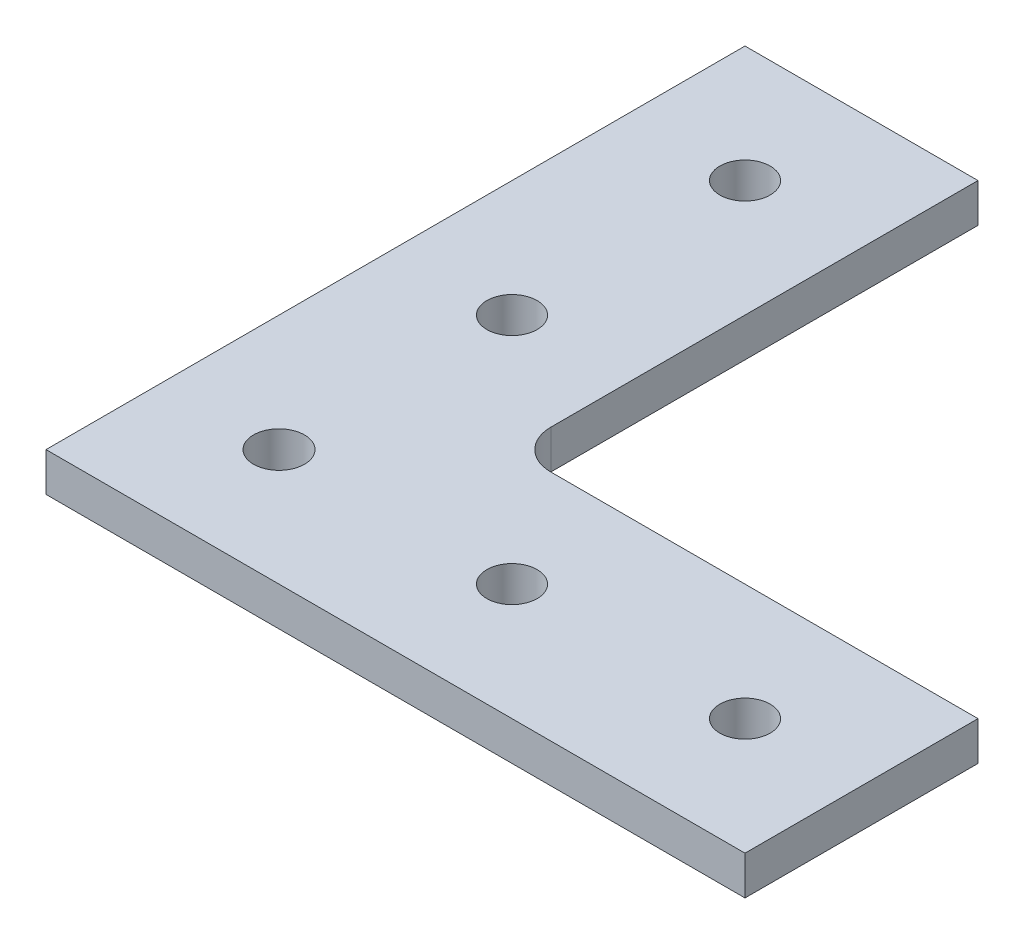
ISO-10303-21;
HEADER;
FILE_DESCRIPTION(('STEP AP214'),'2;1');
FILE_NAME('part.step','',(''),(''),'','','');
FILE_SCHEMA(('AUTOMOTIVE_DESIGN { 1 0 10303 214 1 1 1 1 }'));
ENDSEC;
DATA;
#1=APPLICATION_CONTEXT('core data for automotive mechanical design processes');
#2=APPLICATION_PROTOCOL_DEFINITION('international standard','automotive_design',2000,#1);
#3=PRODUCT_CONTEXT('',#1,'mechanical');
#4=PRODUCT('Part','Part','',(#3));
#5=PRODUCT_RELATED_PRODUCT_CATEGORY('part','',(#4));
#6=PRODUCT_DEFINITION_FORMATION('','',#4);
#7=PRODUCT_DEFINITION_CONTEXT('part definition',#1,'design');
#8=PRODUCT_DEFINITION('design','',#6,#7);
#9=PRODUCT_DEFINITION_SHAPE('','',#8);
#10=(LENGTH_UNIT() NAMED_UNIT(*) SI_UNIT(.MILLI.,.METRE.));
#11=(NAMED_UNIT(*) PLANE_ANGLE_UNIT() SI_UNIT($,.RADIAN.));
#12=(NAMED_UNIT(*) SI_UNIT($,.STERADIAN.) SOLID_ANGLE_UNIT());
#13=UNCERTAINTY_MEASURE_WITH_UNIT(LENGTH_MEASURE(1.E-05),#10,'distance_accuracy_value','');
#14=(GEOMETRIC_REPRESENTATION_CONTEXT(3) GLOBAL_UNCERTAINTY_ASSIGNED_CONTEXT((#13)) GLOBAL_UNIT_ASSIGNED_CONTEXT((#10,
#11,#12)) REPRESENTATION_CONTEXT('',''));
#15=CARTESIAN_POINT('',(0.,0.,0.));
#16=DIRECTION('',(0.,0.,1.));
#17=DIRECTION('',(1.,0.,0.));
#18=AXIS2_PLACEMENT_3D('',#15,#16,#17);
#19=CARTESIAN_POINT('',(-49.9717391304348,6.35,25.2422360248447));
#20=DIRECTION('',(0.,1.,0.));
#21=DIRECTION('',(0.,0.,1.));
#22=AXIS2_PLACEMENT_3D('',#19,#20,#21);
#23=PLANE('',#22);
#24=CARTESIAN_POINT('',(-75.3717391304348,6.35,12.5422360248447));
#25=DIRECTION('',(0.,1.,0.));
#26=DIRECTION('',(0.,0.,1.));
#27=AXIS2_PLACEMENT_3D('',#24,#25,#26);
#28=CIRCLE('',#27,4.11480000000001);
#29=CARTESIAN_POINT('',(-75.3717391304348,6.35,16.6570360248447));
#30=VERTEX_POINT('',#29);
#31=EDGE_CURVE('E208',#30,#30,#28,.T.);
#32=ORIENTED_EDGE('',*,*,#31,.F.);
#33=EDGE_LOOP('',(#32));
#34=FACE_BOUND('',#33,.T.);
#35=CARTESIAN_POINT('',(-37.2717391304348,6.35,50.6422360248447));
#36=DIRECTION('',(0.,1.,0.));
#37=DIRECTION('',(0.,0.,1.));
#38=AXIS2_PLACEMENT_3D('',#35,#36,#37);
#39=CIRCLE('',#38,4.1148);
#40=CARTESIAN_POINT('',(-37.2717391304348,6.35,54.7570360248447));
#41=VERTEX_POINT('',#40);
#42=EDGE_CURVE('E192',#41,#41,#39,.T.);
#43=ORIENTED_EDGE('',*,*,#42,.F.);
#44=EDGE_LOOP('',(#43));
#45=FACE_BOUND('',#44,.T.);
#46=DIRECTION('',(-1.,0.,0.));
#47=VECTOR('',#46,1.);
#48=CARTESIAN_POINT('',(-56.3217391304348,6.35,-44.6077639751553));
#49=LINE('',#48,#47);
#50=CARTESIAN_POINT('',(-56.3217391304348,6.35,-44.6077639751553));
#51=VERTEX_POINT('',#50);
#52=CARTESIAN_POINT('',(-94.4217391304348,6.35,-44.6077639751553));
#53=VERTEX_POINT('',#52);
#54=EDGE_CURVE('E155',#51,#53,#49,.T.);
#55=ORIENTED_EDGE('',*,*,#54,.T.);
#56=DIRECTION('',(0.,0.,1.));
#57=VECTOR('',#56,1.);
#58=CARTESIAN_POINT('',(-94.4217391304348,6.35,-44.6077639751553));
#59=LINE('',#58,#57);
#60=CARTESIAN_POINT('',(-94.4217391304348,6.35,69.6922360248447));
#61=VERTEX_POINT('',#60);
#62=EDGE_CURVE('E97',#53,#61,#59,.T.);
#63=ORIENTED_EDGE('',*,*,#62,.T.);
#64=DIRECTION('',(1.,0.,0.));
#65=VECTOR('',#64,1.);
#66=CARTESIAN_POINT('',(-94.4217391304348,6.35,69.6922360248447));
#67=LINE('',#66,#65);
#68=CARTESIAN_POINT('',(19.8782608695652,6.35,69.6922360248447));
#69=VERTEX_POINT('',#68);
#70=EDGE_CURVE('E172',#61,#69,#67,.T.);
#71=ORIENTED_EDGE('',*,*,#70,.T.);
#72=DIRECTION('',(0.,0.,-1.));
#73=VECTOR('',#72,1.);
#74=CARTESIAN_POINT('',(19.8782608695652,6.35,69.6922360248447));
#75=LINE('',#74,#73);
#76=CARTESIAN_POINT('',(19.8782608695652,6.35,31.5922360248447));
#77=VERTEX_POINT('',#76);
#78=EDGE_CURVE('E113',#69,#77,#75,.T.);
#79=ORIENTED_EDGE('',*,*,#78,.T.);
#80=DIRECTION('',(-1.,0.,0.));
#81=VECTOR('',#80,1.);
#82=CARTESIAN_POINT('',(19.8782608695652,6.35,31.5922360248447));
#83=LINE('',#82,#81);
#84=CARTESIAN_POINT('',(-49.9717391304348,6.35,31.5922360248447));
#85=VERTEX_POINT('',#84);
#86=EDGE_CURVE('E107',#77,#85,#83,.T.);
#87=ORIENTED_EDGE('',*,*,#86,.T.);
#88=CARTESIAN_POINT('',(-49.9717391304348,6.35,25.2422360248447));
#89=DIRECTION('',(0.,-1.,0.));
#90=DIRECTION('',(0.,0.,1.));
#91=AXIS2_PLACEMENT_3D('',#88,#89,#90);
#92=CIRCLE('',#91,6.34999999999999);
#93=CARTESIAN_POINT('',(-56.3217391304348,6.35,25.2422360248447));
#94=VERTEX_POINT('',#93);
#95=EDGE_CURVE('E111',#85,#94,#92,.T.);
#96=ORIENTED_EDGE('',*,*,#95,.T.);
#97=DIRECTION('',(0.,0.,-1.));
#98=VECTOR('',#97,1.);
#99=CARTESIAN_POINT('',(-56.3217391304348,6.35,25.2422360248447));
#100=LINE('',#99,#98);
#101=EDGE_CURVE('E57',#94,#51,#100,.T.);
#102=ORIENTED_EDGE('',*,*,#101,.T.);
#103=EDGE_LOOP('',(#55,#63,#71,#79,#87,#96,#102));
#104=FACE_BOUND('',#103,.T.);
#105=CARTESIAN_POINT('',(-75.3717391304348,6.35,50.6422360248447));
#106=DIRECTION('',(0.,1.,0.));
#107=DIRECTION('',(0.,0.,1.));
#108=AXIS2_PLACEMENT_3D('',#105,#106,#107);
#109=CIRCLE('',#108,4.1656);
#110=CARTESIAN_POINT('',(-75.3717391304348,6.35,54.8078360248447));
#111=VERTEX_POINT('',#110);
#112=EDGE_CURVE('E140',#111,#111,#109,.T.);
#113=ORIENTED_EDGE('',*,*,#112,.F.);
#114=EDGE_LOOP('',(#113));
#115=FACE_BOUND('',#114,.T.);
#116=CARTESIAN_POINT('',(0.828260869565247,6.35,50.6422360248447));
#117=DIRECTION('',(0.,1.,0.));
#118=DIRECTION('',(0.,0.,1.));
#119=AXIS2_PLACEMENT_3D('',#116,#117,#118);
#120=CIRCLE('',#119,4.1148);
#121=CARTESIAN_POINT('',(0.828260869565247,6.35,54.7570360248447));
#122=VERTEX_POINT('',#121);
#123=EDGE_CURVE('E200',#122,#122,#120,.T.);
#124=ORIENTED_EDGE('',*,*,#123,.F.);
#125=EDGE_LOOP('',(#124));
#126=FACE_BOUND('',#125,.T.);
#127=CARTESIAN_POINT('',(-75.3717391304348,6.35,-25.5577639751553));
#128=DIRECTION('',(0.,1.,0.));
#129=DIRECTION('',(0.,0.,1.));
#130=AXIS2_PLACEMENT_3D('',#127,#128,#129);
#131=CIRCLE('',#130,4.11480000000001);
#132=CARTESIAN_POINT('',(-75.3717391304348,6.35,-21.4429639751553));
#133=VERTEX_POINT('',#132);
#134=EDGE_CURVE('E216',#133,#133,#131,.T.);
#135=ORIENTED_EDGE('',*,*,#134,.F.);
#136=EDGE_LOOP('',(#135));
#137=FACE_BOUND('',#136,.T.);
#138=ADVANCED_FACE('F39',(#34,#45,#104,#115,#126,#137),#23,.T.);
#139=CARTESIAN_POINT('',(-49.9717391304348,0.,25.2422360248447));
#140=DIRECTION('',(0.,1.,0.));
#141=DIRECTION('',(0.,0.,1.));
#142=AXIS2_PLACEMENT_3D('',#139,#140,#141);
#143=PLANE('',#142);
#144=DIRECTION('',(-1.,0.,0.));
#145=VECTOR('',#144,1.);
#146=CARTESIAN_POINT('',(-56.3217391304348,0.,-44.6077639751553));
#147=LINE('',#146,#145);
#148=CARTESIAN_POINT('',(-56.3217391304348,0.,-44.6077639751553));
#149=VERTEX_POINT('',#148);
#150=CARTESIAN_POINT('',(-94.4217391304348,0.,-44.6077639751553));
#151=VERTEX_POINT('',#150);
#152=EDGE_CURVE('E135',#149,#151,#147,.T.);
#153=ORIENTED_EDGE('',*,*,#152,.F.);
#154=DIRECTION('',(0.,0.,-1.));
#155=VECTOR('',#154,1.);
#156=CARTESIAN_POINT('',(-56.3217391304348,0.,25.2422360248447));
#157=LINE('',#156,#155);
#158=CARTESIAN_POINT('',(-56.3217391304348,0.,25.2422360248447));
#159=VERTEX_POINT('',#158);
#160=EDGE_CURVE('E89',#159,#149,#157,.T.);
#161=ORIENTED_EDGE('',*,*,#160,.F.);
#162=CARTESIAN_POINT('',(-49.9717391304348,0.,25.2422360248447));
#163=DIRECTION('',(0.,-1.,0.));
#164=DIRECTION('',(0.,0.,1.));
#165=AXIS2_PLACEMENT_3D('',#162,#163,#164);
#166=CIRCLE('',#165,6.34999999999999);
#167=CARTESIAN_POINT('',(-49.9717391304348,0.,31.5922360248447));
#168=VERTEX_POINT('',#167);
#169=EDGE_CURVE('E83',#168,#159,#166,.T.);
#170=ORIENTED_EDGE('',*,*,#169,.F.);
#171=DIRECTION('',(-1.,0.,0.));
#172=VECTOR('',#171,1.);
#173=CARTESIAN_POINT('',(19.8782608695652,0.,31.5922360248447));
#174=LINE('',#173,#172);
#175=CARTESIAN_POINT('',(19.8782608695652,0.,31.5922360248447));
#176=VERTEX_POINT('',#175);
#177=EDGE_CURVE('E122',#176,#168,#174,.T.);
#178=ORIENTED_EDGE('',*,*,#177,.F.);
#179=DIRECTION('',(0.,0.,-1.));
#180=VECTOR('',#179,1.);
#181=CARTESIAN_POINT('',(19.8782608695652,0.,69.6922360248447));
#182=LINE('',#181,#180);
#183=CARTESIAN_POINT('',(19.8782608695652,0.,69.6922360248447));
#184=VERTEX_POINT('',#183);
#185=EDGE_CURVE('E146',#184,#176,#182,.T.);
#186=ORIENTED_EDGE('',*,*,#185,.F.);
#187=DIRECTION('',(1.,0.,0.));
#188=VECTOR('',#187,1.);
#189=CARTESIAN_POINT('',(-94.4217391304348,0.,69.6922360248447));
#190=LINE('',#189,#188);
#191=CARTESIAN_POINT('',(-94.4217391304348,0.,69.6922360248447));
#192=VERTEX_POINT('',#191);
#193=EDGE_CURVE('E143',#192,#184,#190,.T.);
#194=ORIENTED_EDGE('',*,*,#193,.F.);
#195=DIRECTION('',(0.,0.,1.));
#196=VECTOR('',#195,1.);
#197=CARTESIAN_POINT('',(-94.4217391304348,0.,-44.6077639751553));
#198=LINE('',#197,#196);
#199=EDGE_CURVE('E139',#151,#192,#198,.T.);
#200=ORIENTED_EDGE('',*,*,#199,.F.);
#201=EDGE_LOOP('',(#153,#161,#170,#178,#186,#194,#200));
#202=FACE_BOUND('',#201,.T.);
#203=CARTESIAN_POINT('',(-75.3717391304348,0.,50.6422360248447));
#204=DIRECTION('',(0.,1.,0.));
#205=DIRECTION('',(0.,0.,1.));
#206=AXIS2_PLACEMENT_3D('',#203,#204,#205);
#207=CIRCLE('',#206,4.1656);
#208=CARTESIAN_POINT('',(-75.3717391304348,0.,54.8078360248447));
#209=VERTEX_POINT('',#208);
#210=EDGE_CURVE('E188',#209,#209,#207,.T.);
#211=ORIENTED_EDGE('',*,*,#210,.T.);
#212=EDGE_LOOP('',(#211));
#213=FACE_BOUND('',#212,.T.);
#214=CARTESIAN_POINT('',(-37.2717391304348,0.,50.6422360248447));
#215=DIRECTION('',(0.,1.,0.));
#216=DIRECTION('',(0.,0.,1.));
#217=AXIS2_PLACEMENT_3D('',#214,#215,#216);
#218=CIRCLE('',#217,4.1148);
#219=CARTESIAN_POINT('',(-37.2717391304348,0.,54.7570360248447));
#220=VERTEX_POINT('',#219);
#221=EDGE_CURVE('E196',#220,#220,#218,.T.);
#222=ORIENTED_EDGE('',*,*,#221,.T.);
#223=EDGE_LOOP('',(#222));
#224=FACE_BOUND('',#223,.T.);
#225=CARTESIAN_POINT('',(0.828260869565247,0.,50.6422360248447));
#226=DIRECTION('',(0.,1.,0.));
#227=DIRECTION('',(0.,0.,1.));
#228=AXIS2_PLACEMENT_3D('',#225,#226,#227);
#229=CIRCLE('',#228,4.1148);
#230=CARTESIAN_POINT('',(0.828260869565247,0.,54.7570360248447));
#231=VERTEX_POINT('',#230);
#232=EDGE_CURVE('E204',#231,#231,#229,.T.);
#233=ORIENTED_EDGE('',*,*,#232,.T.);
#234=EDGE_LOOP('',(#233));
#235=FACE_BOUND('',#234,.T.);
#236=CARTESIAN_POINT('',(-75.3717391304348,0.,12.5422360248447));
#237=DIRECTION('',(0.,1.,0.));
#238=DIRECTION('',(0.,0.,1.));
#239=AXIS2_PLACEMENT_3D('',#236,#237,#238);
#240=CIRCLE('',#239,4.11480000000001);
#241=CARTESIAN_POINT('',(-75.3717391304348,0.,16.6570360248447));
#242=VERTEX_POINT('',#241);
#243=EDGE_CURVE('E212',#242,#242,#240,.T.);
#244=ORIENTED_EDGE('',*,*,#243,.T.);
#245=EDGE_LOOP('',(#244));
#246=FACE_BOUND('',#245,.T.);
#247=CARTESIAN_POINT('',(-75.3717391304348,0.,-25.5577639751553));
#248=DIRECTION('',(0.,1.,0.));
#249=DIRECTION('',(0.,0.,1.));
#250=AXIS2_PLACEMENT_3D('',#247,#248,#249);
#251=CIRCLE('',#250,4.11480000000001);
#252=CARTESIAN_POINT('',(-75.3717391304348,0.,-21.4429639751553));
#253=VERTEX_POINT('',#252);
#254=EDGE_CURVE('E220',#253,#253,#251,.T.);
#255=ORIENTED_EDGE('',*,*,#254,.T.);
#256=EDGE_LOOP('',(#255));
#257=FACE_BOUND('',#256,.T.);
#258=ADVANCED_FACE('F176',(#202,#213,#224,#235,#246,#257),#143,.F.);
#259=CARTESIAN_POINT('',(-56.3217391304348,6.35,-44.6077639751553));
#260=DIRECTION('',(0.,0.,1.));
#261=DIRECTION('',(1.,0.,0.));
#262=AXIS2_PLACEMENT_3D('',#259,#260,#261);
#263=PLANE('',#262);
#264=ORIENTED_EDGE('',*,*,#152,.T.);
#265=DIRECTION('',(0.,-1.,0.));
#266=VECTOR('',#265,1.);
#267=CARTESIAN_POINT('',(-94.4217391304348,6.35,-44.6077639751553));
#268=LINE('',#267,#266);
#269=EDGE_CURVE('E11',#53,#151,#268,.T.);
#270=ORIENTED_EDGE('',*,*,#269,.F.);
#271=ORIENTED_EDGE('',*,*,#54,.F.);
#272=DIRECTION('',(0.,-1.,0.));
#273=VECTOR('',#272,1.);
#274=CARTESIAN_POINT('',(-56.3217391304348,6.35,-44.6077639751553));
#275=LINE('',#274,#273);
#276=EDGE_CURVE('E131',#51,#149,#275,.T.);
#277=ORIENTED_EDGE('',*,*,#276,.T.);
#278=EDGE_LOOP('',(#264,#270,#271,#277));
#279=FACE_BOUND('',#278,.T.);
#280=ADVANCED_FACE('F41',(#279),#263,.F.);
#281=CARTESIAN_POINT('',(-94.4217391304348,6.35,-44.6077639751553));
#282=DIRECTION('',(1.,0.,0.));
#283=DIRECTION('',(0.,0.,-1.));
#284=AXIS2_PLACEMENT_3D('',#281,#282,#283);
#285=PLANE('',#284);
#286=ORIENTED_EDGE('',*,*,#199,.T.);
#287=DIRECTION('',(0.,-1.,0.));
#288=VECTOR('',#287,1.);
#289=CARTESIAN_POINT('',(-94.4217391304348,6.35,69.6922360248447));
#290=LINE('',#289,#288);
#291=EDGE_CURVE('E49',#61,#192,#290,.T.);
#292=ORIENTED_EDGE('',*,*,#291,.F.);
#293=ORIENTED_EDGE('',*,*,#62,.F.);
#294=ORIENTED_EDGE('',*,*,#269,.T.);
#295=EDGE_LOOP('',(#286,#292,#293,#294));
#296=FACE_BOUND('',#295,.T.);
#297=ADVANCED_FACE('F254',(#296),#285,.F.);
#298=CARTESIAN_POINT('',(-94.4217391304348,6.35,69.6922360248447));
#299=DIRECTION('',(0.,0.,-1.));
#300=DIRECTION('',(-1.,0.,0.));
#301=AXIS2_PLACEMENT_3D('',#298,#299,#300);
#302=PLANE('',#301);
#303=ORIENTED_EDGE('',*,*,#193,.T.);
#304=DIRECTION('',(0.,-1.,0.));
#305=VECTOR('',#304,1.);
#306=CARTESIAN_POINT('',(19.8782608695652,6.35,69.6922360248447));
#307=LINE('',#306,#305);
#308=EDGE_CURVE('E162',#69,#184,#307,.T.);
#309=ORIENTED_EDGE('',*,*,#308,.F.);
#310=ORIENTED_EDGE('',*,*,#70,.F.);
#311=ORIENTED_EDGE('',*,*,#291,.T.);
#312=EDGE_LOOP('',(#303,#309,#310,#311));
#313=FACE_BOUND('',#312,.T.);
#314=ADVANCED_FACE('F170',(#313),#302,.F.);
#315=CARTESIAN_POINT('',(19.8782608695652,6.35,69.6922360248447));
#316=DIRECTION('',(-1.,0.,0.));
#317=DIRECTION('',(0.,0.,1.));
#318=AXIS2_PLACEMENT_3D('',#315,#316,#317);
#319=PLANE('',#318);
#320=ORIENTED_EDGE('',*,*,#185,.T.);
#321=DIRECTION('',(0.,-1.,0.));
#322=VECTOR('',#321,1.);
#323=CARTESIAN_POINT('',(19.8782608695652,6.35,31.5922360248447));
#324=LINE('',#323,#322);
#325=EDGE_CURVE('E124',#77,#176,#324,.T.);
#326=ORIENTED_EDGE('',*,*,#325,.F.);
#327=ORIENTED_EDGE('',*,*,#78,.F.);
#328=ORIENTED_EDGE('',*,*,#308,.T.);
#329=EDGE_LOOP('',(#320,#326,#327,#328));
#330=FACE_BOUND('',#329,.T.);
#331=ADVANCED_FACE('F179',(#330),#319,.F.);
#332=CARTESIAN_POINT('',(19.8782608695652,6.35,31.5922360248447));
#333=DIRECTION('',(0.,0.,1.));
#334=DIRECTION('',(1.,0.,0.));
#335=AXIS2_PLACEMENT_3D('',#332,#333,#334);
#336=PLANE('',#335);
#337=ORIENTED_EDGE('',*,*,#177,.T.);
#338=DIRECTION('',(0.,-1.,0.));
#339=VECTOR('',#338,1.);
#340=CARTESIAN_POINT('',(-49.9717391304348,6.35,31.5922360248447));
#341=LINE('',#340,#339);
#342=EDGE_CURVE('E119',#85,#168,#341,.T.);
#343=ORIENTED_EDGE('',*,*,#342,.F.);
#344=ORIENTED_EDGE('',*,*,#86,.F.);
#345=ORIENTED_EDGE('',*,*,#325,.T.);
#346=EDGE_LOOP('',(#337,#343,#344,#345));
#347=FACE_BOUND('',#346,.T.);
#348=ADVANCED_FACE('F120',(#347),#336,.F.);
#349=CARTESIAN_POINT('',(-49.9717391304348,6.35,25.2422360248447));
#350=DIRECTION('',(0.,-1.,0.));
#351=DIRECTION('',(0.,0.,-1.));
#352=AXIS2_PLACEMENT_3D('',#349,#350,#351);
#353=CYLINDRICAL_SURFACE('',#352,6.34999999999999);
#354=ORIENTED_EDGE('',*,*,#169,.T.);
#355=DIRECTION('',(0.,-1.,0.));
#356=VECTOR('',#355,1.);
#357=CARTESIAN_POINT('',(-56.3217391304348,6.35,25.2422360248447));
#358=LINE('',#357,#356);
#359=EDGE_CURVE('E125',#94,#159,#358,.T.);
#360=ORIENTED_EDGE('',*,*,#359,.F.);
#361=ORIENTED_EDGE('',*,*,#95,.F.);
#362=ORIENTED_EDGE('',*,*,#342,.T.);
#363=EDGE_LOOP('',(#354,#360,#361,#362));
#364=FACE_BOUND('',#363,.T.);
#365=ADVANCED_FACE('F127',(#364),#353,.F.);
#366=CARTESIAN_POINT('',(-56.3217391304348,6.35,25.2422360248447));
#367=DIRECTION('',(-1.,0.,0.));
#368=DIRECTION('',(0.,0.,1.));
#369=AXIS2_PLACEMENT_3D('',#366,#367,#368);
#370=PLANE('',#369);
#371=ORIENTED_EDGE('',*,*,#160,.T.);
#372=ORIENTED_EDGE('',*,*,#276,.F.);
#373=ORIENTED_EDGE('',*,*,#101,.F.);
#374=ORIENTED_EDGE('',*,*,#359,.T.);
#375=EDGE_LOOP('',(#371,#372,#373,#374));
#376=FACE_BOUND('',#375,.T.);
#377=ADVANCED_FACE('F244',(#376),#370,.F.);
#378=CARTESIAN_POINT('',(-75.3717391304348,6.35,50.6422360248447));
#379=DIRECTION('',(0.,-1.,0.));
#380=DIRECTION('',(0.,0.,-1.));
#381=AXIS2_PLACEMENT_3D('',#378,#379,#380);
#382=CYLINDRICAL_SURFACE('',#381,4.1656);
#383=ORIENTED_EDGE('',*,*,#112,.T.);
#384=EDGE_LOOP('',(#383));
#385=FACE_BOUND('',#384,.T.);
#386=ORIENTED_EDGE('',*,*,#210,.F.);
#387=EDGE_LOOP('',(#386));
#388=FACE_BOUND('',#387,.T.);
#389=ADVANCED_FACE('F241',(#385,#388),#382,.F.);
#390=CARTESIAN_POINT('',(-37.2717391304348,6.35,50.6422360248447));
#391=DIRECTION('',(0.,-1.,0.));
#392=DIRECTION('',(0.,0.,-1.));
#393=AXIS2_PLACEMENT_3D('',#390,#391,#392);
#394=CYLINDRICAL_SURFACE('',#393,4.1148);
#395=ORIENTED_EDGE('',*,*,#42,.T.);
#396=EDGE_LOOP('',(#395));
#397=FACE_BOUND('',#396,.T.);
#398=ORIENTED_EDGE('',*,*,#221,.F.);
#399=EDGE_LOOP('',(#398));
#400=FACE_BOUND('',#399,.T.);
#401=ADVANCED_FACE('F313',(#397,#400),#394,.F.);
#402=CARTESIAN_POINT('',(0.828260869565247,6.35,50.6422360248447));
#403=DIRECTION('',(0.,-1.,0.));
#404=DIRECTION('',(0.,0.,-1.));
#405=AXIS2_PLACEMENT_3D('',#402,#403,#404);
#406=CYLINDRICAL_SURFACE('',#405,4.1148);
#407=ORIENTED_EDGE('',*,*,#123,.T.);
#408=EDGE_LOOP('',(#407));
#409=FACE_BOUND('',#408,.T.);
#410=ORIENTED_EDGE('',*,*,#232,.F.);
#411=EDGE_LOOP('',(#410));
#412=FACE_BOUND('',#411,.T.);
#413=ADVANCED_FACE('F321',(#409,#412),#406,.F.);
#414=CARTESIAN_POINT('',(-75.3717391304348,6.35,12.5422360248447));
#415=DIRECTION('',(0.,-1.,0.));
#416=DIRECTION('',(0.,0.,-1.));
#417=AXIS2_PLACEMENT_3D('',#414,#415,#416);
#418=CYLINDRICAL_SURFACE('',#417,4.11480000000001);
#419=ORIENTED_EDGE('',*,*,#31,.T.);
#420=EDGE_LOOP('',(#419));
#421=FACE_BOUND('',#420,.T.);
#422=ORIENTED_EDGE('',*,*,#243,.F.);
#423=EDGE_LOOP('',(#422));
#424=FACE_BOUND('',#423,.T.);
#425=ADVANCED_FACE('F329',(#421,#424),#418,.F.);
#426=CARTESIAN_POINT('',(-75.3717391304348,6.35,-25.5577639751553));
#427=DIRECTION('',(0.,-1.,0.));
#428=DIRECTION('',(0.,0.,-1.));
#429=AXIS2_PLACEMENT_3D('',#426,#427,#428);
#430=CYLINDRICAL_SURFACE('',#429,4.11480000000001);
#431=ORIENTED_EDGE('',*,*,#134,.T.);
#432=EDGE_LOOP('',(#431));
#433=FACE_BOUND('',#432,.T.);
#434=ORIENTED_EDGE('',*,*,#254,.F.);
#435=EDGE_LOOP('',(#434));
#436=FACE_BOUND('',#435,.T.);
#437=ADVANCED_FACE('F228',(#433,#436),#430,.F.);
#438=CLOSED_SHELL('',(#138,#258,#280,#297,#314,#331,#348,#365,#377,#389,#401,#413,#425,#437));
#439=MANIFOLD_SOLID_BREP('B2',#438);
#440=ADVANCED_BREP_SHAPE_REPRESENTATION('',(#18,#439),#14);
#441=SHAPE_DEFINITION_REPRESENTATION(#9,#440);
ENDSEC;
END-ISO-10303-21;
